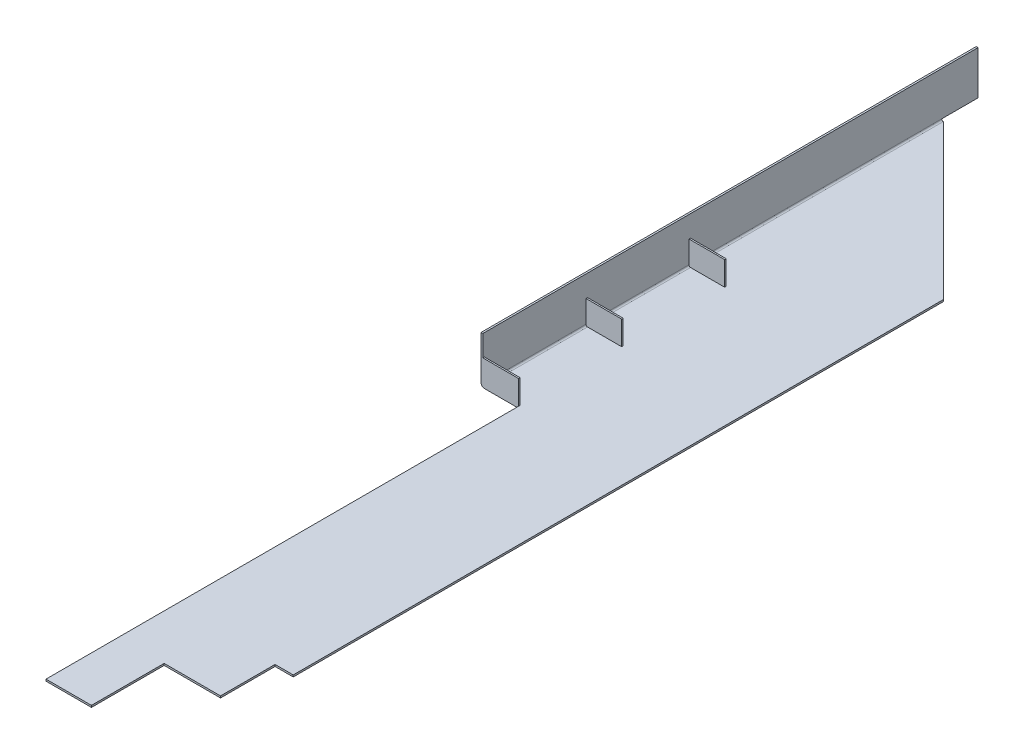
ISO-10303-21;
HEADER;
FILE_DESCRIPTION(('STEP AP214'),'2;1');
FILE_NAME('part.step','',(''),(''),'','','');
FILE_SCHEMA(('AUTOMOTIVE_DESIGN { 1 0 10303 214 1 1 1 1 }'));
ENDSEC;
DATA;
#1=APPLICATION_CONTEXT('core data for automotive mechanical design processes');
#2=APPLICATION_PROTOCOL_DEFINITION('international standard','automotive_design',2000,#1);
#3=PRODUCT_CONTEXT('',#1,'mechanical');
#4=PRODUCT('Part','Part','',(#3));
#5=PRODUCT_RELATED_PRODUCT_CATEGORY('part','',(#4));
#6=PRODUCT_DEFINITION_FORMATION('','',#4);
#7=PRODUCT_DEFINITION_CONTEXT('part definition',#1,'design');
#8=PRODUCT_DEFINITION('design','',#6,#7);
#9=PRODUCT_DEFINITION_SHAPE('','',#8);
#10=(LENGTH_UNIT() NAMED_UNIT(*) SI_UNIT(.MILLI.,.METRE.));
#11=(NAMED_UNIT(*) PLANE_ANGLE_UNIT() SI_UNIT($,.RADIAN.));
#12=(NAMED_UNIT(*) SI_UNIT($,.STERADIAN.) SOLID_ANGLE_UNIT());
#13=UNCERTAINTY_MEASURE_WITH_UNIT(LENGTH_MEASURE(1.E-05),#10,'distance_accuracy_value','');
#14=(GEOMETRIC_REPRESENTATION_CONTEXT(3) GLOBAL_UNCERTAINTY_ASSIGNED_CONTEXT((#13)) GLOBAL_UNIT_ASSIGNED_CONTEXT((#10,
#11,#12)) REPRESENTATION_CONTEXT('',''));
#15=CARTESIAN_POINT('',(0.,0.,0.));
#16=DIRECTION('',(0.,0.,1.));
#17=DIRECTION('',(1.,0.,0.));
#18=AXIS2_PLACEMENT_3D('',#15,#16,#17);
#19=CARTESIAN_POINT('',(475.,-56.,1885.));
#20=DIRECTION('',(0.,0.,1.));
#21=DIRECTION('',(1.,0.,0.));
#22=AXIS2_PLACEMENT_3D('',#19,#20,#21);
#23=PLANE('',#22);
#24=DIRECTION('',(1.,0.,0.));
#25=VECTOR('',#24,1.);
#26=CARTESIAN_POINT('',(612.,-53.,1885.));
#27=LINE('',#26,#25);
#28=CARTESIAN_POINT('',(612.,-53.,1885.));
#29=VERTEX_POINT('',#28);
#30=CARTESIAN_POINT('',(705.,-53.,1885.));
#31=VERTEX_POINT('',#30);
#32=EDGE_CURVE('E304',#29,#31,#27,.T.);
#33=ORIENTED_EDGE('',*,*,#32,.F.);
#34=DIRECTION('',(0.,1.,0.));
#35=VECTOR('',#34,1.);
#36=CARTESIAN_POINT('',(612.,-56.,1885.));
#37=LINE('',#36,#35);
#38=CARTESIAN_POINT('',(612.,-56.,1885.));
#39=VERTEX_POINT('',#38);
#40=EDGE_CURVE('E36',#39,#29,#37,.T.);
#41=ORIENTED_EDGE('',*,*,#40,.F.);
#42=DIRECTION('',(-1.,0.,0.));
#43=VECTOR('',#42,1.);
#44=CARTESIAN_POINT('',(705.,-56.,1885.));
#45=LINE('',#44,#43);
#46=CARTESIAN_POINT('',(705.,-56.,1885.));
#47=VERTEX_POINT('',#46);
#48=EDGE_CURVE('E320',#47,#39,#45,.T.);
#49=ORIENTED_EDGE('',*,*,#48,.F.);
#50=DIRECTION('',(0.,1.,0.));
#51=VECTOR('',#50,1.);
#52=CARTESIAN_POINT('',(705.,-56.,1885.));
#53=LINE('',#52,#51);
#54=EDGE_CURVE('E11',#47,#31,#53,.T.);
#55=ORIENTED_EDGE('',*,*,#54,.T.);
#56=EDGE_LOOP('',(#33,#41,#49,#55));
#57=FACE_BOUND('',#56,.T.);
#58=ADVANCED_FACE('F17',(#57),#23,.T.);
#59=CARTESIAN_POINT('',(705.,-56.,1885.));
#60=DIRECTION('',(-1.,0.,0.));
#61=DIRECTION('',(0.,-1.,0.));
#62=AXIS2_PLACEMENT_3D('',#59,#60,#61);
#63=PLANE('',#62);
#64=DIRECTION('',(0.,0.,-1.));
#65=VECTOR('',#64,1.);
#66=CARTESIAN_POINT('',(705.,-56.,1885.));
#67=LINE('',#66,#65);
#68=CARTESIAN_POINT('',(705.,-56.,1795.));
#69=VERTEX_POINT('',#68);
#70=EDGE_CURVE('E27',#47,#69,#67,.T.);
#71=ORIENTED_EDGE('',*,*,#70,.T.);
#72=DIRECTION('',(0.,1.,0.));
#73=VECTOR('',#72,1.);
#74=CARTESIAN_POINT('',(705.,-56.,1795.));
#75=LINE('',#74,#73);
#76=CARTESIAN_POINT('',(705.,-53.,1795.));
#77=VERTEX_POINT('',#76);
#78=EDGE_CURVE('E215',#69,#77,#75,.T.);
#79=ORIENTED_EDGE('',*,*,#78,.T.);
#80=DIRECTION('',(0.,0.,-1.));
#81=VECTOR('',#80,1.);
#82=CARTESIAN_POINT('',(705.,-53.,1885.));
#83=LINE('',#82,#81);
#84=EDGE_CURVE('E299',#31,#77,#83,.T.);
#85=ORIENTED_EDGE('',*,*,#84,.F.);
#86=ORIENTED_EDGE('',*,*,#54,.F.);
#87=EDGE_LOOP('',(#71,#79,#85,#86));
#88=FACE_BOUND('',#87,.T.);
#89=ADVANCED_FACE('F490',(#88),#63,.F.);
#90=CARTESIAN_POINT('',(735.,-53.,1885.));
#91=DIRECTION('',(0.,1.,0.));
#92=DIRECTION('',(0.,0.,-1.));
#93=AXIS2_PLACEMENT_3D('',#90,#91,#92);
#94=PLANE('',#93);
#95=DIRECTION('',(-1.,0.,0.));
#96=VECTOR('',#95,1.);
#97=CARTESIAN_POINT('',(735.,-53.,1795.));
#98=LINE('',#97,#96);
#99=CARTESIAN_POINT('',(735.,-53.,1795.));
#100=VERTEX_POINT('',#99);
#101=EDGE_CURVE('E201',#100,#77,#98,.T.);
#102=ORIENTED_EDGE('',*,*,#101,.F.);
#103=DIRECTION('',(0.,0.,1.));
#104=VECTOR('',#103,1.);
#105=CARTESIAN_POINT('',(735.,-53.,722.));
#106=LINE('',#105,#104);
#107=CARTESIAN_POINT('',(735.,-53.,722.));
#108=VERTEX_POINT('',#107);
#109=EDGE_CURVE('E194',#108,#100,#106,.T.);
#110=ORIENTED_EDGE('',*,*,#109,.F.);
#111=DIRECTION('',(-0.707106781186548,0.,-0.707106781186548));
#112=VECTOR('',#111,1.);
#113=CARTESIAN_POINT('',(735.,-53.,722.));
#114=LINE('',#113,#112);
#115=CARTESIAN_POINT('',(481.,-53.,468.));
#116=VERTEX_POINT('',#115);
#117=EDGE_CURVE('E197',#108,#116,#114,.T.);
#118=ORIENTED_EDGE('',*,*,#117,.T.);
#119=DIRECTION('',(1.,0.,0.));
#120=VECTOR('',#119,1.);
#121=CARTESIAN_POINT('',(480.6,-53.,468.));
#122=LINE('',#121,#120);
#123=CARTESIAN_POINT('',(480.6,-53.,468.));
#124=VERTEX_POINT('',#123);
#125=EDGE_CURVE('E289',#124,#116,#122,.T.);
#126=ORIENTED_EDGE('',*,*,#125,.F.);
#127=DIRECTION('',(0.,0.,1.));
#128=VECTOR('',#127,1.);
#129=CARTESIAN_POINT('',(480.6,-53.,468.));
#130=LINE('',#129,#128);
#131=CARTESIAN_POINT('',(480.6,-53.,882.5));
#132=VERTEX_POINT('',#131);
#133=EDGE_CURVE('E216',#124,#132,#130,.T.);
#134=ORIENTED_EDGE('',*,*,#133,.T.);
#135=DIRECTION('',(1.,0.,0.));
#136=VECTOR('',#135,1.);
#137=CARTESIAN_POINT('',(480.6,-53.,882.5));
#138=LINE('',#137,#136);
#139=CARTESIAN_POINT('',(537.,-53.,882.5));
#140=VERTEX_POINT('',#139);
#141=EDGE_CURVE('E372',#132,#140,#138,.T.);
#142=ORIENTED_EDGE('',*,*,#141,.T.);
#143=DIRECTION('',(0.,0.,-1.));
#144=VECTOR('',#143,1.);
#145=CARTESIAN_POINT('',(537.,-53.,885.));
#146=LINE('',#145,#144);
#147=CARTESIAN_POINT('',(537.,-53.,885.));
#148=VERTEX_POINT('',#147);
#149=EDGE_CURVE('E408',#148,#140,#146,.T.);
#150=ORIENTED_EDGE('',*,*,#149,.F.);
#151=DIRECTION('',(1.,0.,0.));
#152=VECTOR('',#151,1.);
#153=CARTESIAN_POINT('',(480.6,-53.,885.));
#154=LINE('',#153,#152);
#155=CARTESIAN_POINT('',(480.6,-53.,885.));
#156=VERTEX_POINT('',#155);
#157=EDGE_CURVE('E244',#156,#148,#154,.T.);
#158=ORIENTED_EDGE('',*,*,#157,.F.);
#159=DIRECTION('',(0.,0.,1.));
#160=VECTOR('',#159,1.);
#161=CARTESIAN_POINT('',(480.6,-53.,885.));
#162=LINE('',#161,#160);
#163=CARTESIAN_POINT('',(480.6,-53.,1052.5));
#164=VERTEX_POINT('',#163);
#165=EDGE_CURVE('E295',#156,#164,#162,.T.);
#166=ORIENTED_EDGE('',*,*,#165,.T.);
#167=DIRECTION('',(1.,0.,0.));
#168=VECTOR('',#167,1.);
#169=CARTESIAN_POINT('',(480.6,-53.,1052.5));
#170=LINE('',#169,#168);
#171=CARTESIAN_POINT('',(537.,-53.,1052.5));
#172=VERTEX_POINT('',#171);
#173=EDGE_CURVE('E292',#164,#172,#170,.T.);
#174=ORIENTED_EDGE('',*,*,#173,.T.);
#175=DIRECTION('',(0.,0.,-1.));
#176=VECTOR('',#175,1.);
#177=CARTESIAN_POINT('',(537.,-53.,1055.));
#178=LINE('',#177,#176);
#179=CARTESIAN_POINT('',(537.,-53.,1055.));
#180=VERTEX_POINT('',#179);
#181=EDGE_CURVE('E308',#180,#172,#178,.T.);
#182=ORIENTED_EDGE('',*,*,#181,.F.);
#183=DIRECTION('',(1.,0.,0.));
#184=VECTOR('',#183,1.);
#185=CARTESIAN_POINT('',(480.6,-53.,1055.));
#186=LINE('',#185,#184);
#187=CARTESIAN_POINT('',(480.6,-53.,1055.));
#188=VERTEX_POINT('',#187);
#189=EDGE_CURVE('E354',#188,#180,#186,.T.);
#190=ORIENTED_EDGE('',*,*,#189,.F.);
#191=DIRECTION('',(0.,0.,1.));
#192=VECTOR('',#191,1.);
#193=CARTESIAN_POINT('',(480.6,-53.,1055.));
#194=LINE('',#193,#192);
#195=CARTESIAN_POINT('',(480.6,-53.,1222.5));
#196=VERTEX_POINT('',#195);
#197=EDGE_CURVE('E296',#188,#196,#194,.T.);
#198=ORIENTED_EDGE('',*,*,#197,.T.);
#199=DIRECTION('',(1.,0.,0.));
#200=VECTOR('',#199,1.);
#201=CARTESIAN_POINT('',(480.6,-53.,1222.5));
#202=LINE('',#201,#200);
#203=CARTESIAN_POINT('',(537.,-53.,1222.5));
#204=VERTEX_POINT('',#203);
#205=EDGE_CURVE('E355',#196,#204,#202,.T.);
#206=ORIENTED_EDGE('',*,*,#205,.T.);
#207=DIRECTION('',(0.,0.,-1.));
#208=VECTOR('',#207,1.);
#209=CARTESIAN_POINT('',(537.,-53.,1225.));
#210=LINE('',#209,#208);
#211=CARTESIAN_POINT('',(537.,-53.,1225.));
#212=VERTEX_POINT('',#211);
#213=EDGE_CURVE('E287',#212,#204,#210,.T.);
#214=ORIENTED_EDGE('',*,*,#213,.F.);
#215=DIRECTION('',(0.,0.,-1.));
#216=VECTOR('',#215,1.);
#217=CARTESIAN_POINT('',(537.,-53.,2005.));
#218=LINE('',#217,#216);
#219=CARTESIAN_POINT('',(537.,-53.,2005.));
#220=VERTEX_POINT('',#219);
#221=EDGE_CURVE('E276',#220,#212,#218,.T.);
#222=ORIENTED_EDGE('',*,*,#221,.F.);
#223=DIRECTION('',(-1.,0.,0.));
#224=VECTOR('',#223,1.);
#225=CARTESIAN_POINT('',(612.,-53.,2005.));
#226=LINE('',#225,#224);
#227=CARTESIAN_POINT('',(612.,-53.,2005.));
#228=VERTEX_POINT('',#227);
#229=EDGE_CURVE('E360',#228,#220,#226,.T.);
#230=ORIENTED_EDGE('',*,*,#229,.F.);
#231=DIRECTION('',(0.,0.,1.));
#232=VECTOR('',#231,1.);
#233=CARTESIAN_POINT('',(612.,-53.,1885.));
#234=LINE('',#233,#232);
#235=EDGE_CURVE('E297',#29,#228,#234,.T.);
#236=ORIENTED_EDGE('',*,*,#235,.F.);
#237=ORIENTED_EDGE('',*,*,#32,.T.);
#238=ORIENTED_EDGE('',*,*,#84,.T.);
#239=EDGE_LOOP('',(#102,#110,#118,#126,#134,#142,#150,#158,#166,#174,#182,#190,#198,#206,#214,
#222,#230,#236,#237,#238));
#240=FACE_BOUND('',#239,.T.);
#241=ADVANCED_FACE('F196',(#240),#94,.T.);
#242=CARTESIAN_POINT('',(612.,-56.,1885.));
#243=DIRECTION('',(1.,0.,0.));
#244=DIRECTION('',(0.,0.,1.));
#245=AXIS2_PLACEMENT_3D('',#242,#243,#244);
#246=PLANE('',#245);
#247=ORIENTED_EDGE('',*,*,#235,.T.);
#248=DIRECTION('',(0.,1.,0.));
#249=VECTOR('',#248,1.);
#250=CARTESIAN_POINT('',(612.,-56.,2005.));
#251=LINE('',#250,#249);
#252=CARTESIAN_POINT('',(612.,-56.,2005.));
#253=VERTEX_POINT('',#252);
#254=EDGE_CURVE('E279',#253,#228,#251,.T.);
#255=ORIENTED_EDGE('',*,*,#254,.F.);
#256=DIRECTION('',(0.,0.,1.));
#257=VECTOR('',#256,1.);
#258=CARTESIAN_POINT('',(612.,-56.,1885.));
#259=LINE('',#258,#257);
#260=EDGE_CURVE('E242',#39,#253,#259,.T.);
#261=ORIENTED_EDGE('',*,*,#260,.F.);
#262=ORIENTED_EDGE('',*,*,#40,.T.);
#263=EDGE_LOOP('',(#247,#255,#261,#262));
#264=FACE_BOUND('',#263,.T.);
#265=ADVANCED_FACE('F547',(#264),#246,.T.);
#266=CARTESIAN_POINT('',(480.6,-56.,1885.));
#267=DIRECTION('',(0.,-1.,0.));
#268=DIRECTION('',(1.,0.,0.));
#269=AXIS2_PLACEMENT_3D('',#266,#267,#268);
#270=PLANE('',#269);
#271=ORIENTED_EDGE('',*,*,#48,.T.);
#272=ORIENTED_EDGE('',*,*,#260,.T.);
#273=DIRECTION('',(-1.,0.,0.));
#274=VECTOR('',#273,1.);
#275=CARTESIAN_POINT('',(612.,-56.,2005.));
#276=LINE('',#275,#274);
#277=CARTESIAN_POINT('',(537.,-56.,2005.));
#278=VERTEX_POINT('',#277);
#279=EDGE_CURVE('E239',#253,#278,#276,.T.);
#280=ORIENTED_EDGE('',*,*,#279,.T.);
#281=DIRECTION('',(0.,0.,-1.));
#282=VECTOR('',#281,1.);
#283=CARTESIAN_POINT('',(537.,-56.,2005.));
#284=LINE('',#283,#282);
#285=CARTESIAN_POINT('',(537.,-56.,1225.));
#286=VERTEX_POINT('',#285);
#287=EDGE_CURVE('E243',#278,#286,#284,.T.);
#288=ORIENTED_EDGE('',*,*,#287,.T.);
#289=DIRECTION('',(1.,0.,0.));
#290=VECTOR('',#289,1.);
#291=CARTESIAN_POINT('',(480.6,-56.,1225.));
#292=LINE('',#291,#290);
#293=CARTESIAN_POINT('',(480.6,-56.,1225.));
#294=VERTEX_POINT('',#293);
#295=EDGE_CURVE('E266',#294,#286,#292,.T.);
#296=ORIENTED_EDGE('',*,*,#295,.F.);
#297=DIRECTION('',(0.,0.,1.));
#298=VECTOR('',#297,1.);
#299=CARTESIAN_POINT('',(480.6,-56.,468.));
#300=LINE('',#299,#298);
#301=CARTESIAN_POINT('',(480.6,-56.,468.));
#302=VERTEX_POINT('',#301);
#303=EDGE_CURVE('E334',#302,#294,#300,.T.);
#304=ORIENTED_EDGE('',*,*,#303,.F.);
#305=DIRECTION('',(-1.,0.,0.));
#306=VECTOR('',#305,1.);
#307=CARTESIAN_POINT('',(481.,-56.,468.));
#308=LINE('',#307,#306);
#309=CARTESIAN_POINT('',(481.,-56.,468.));
#310=VERTEX_POINT('',#309);
#311=EDGE_CURVE('E283',#310,#302,#308,.T.);
#312=ORIENTED_EDGE('',*,*,#311,.F.);
#313=DIRECTION('',(-0.707106781186548,0.,-0.707106781186548));
#314=VECTOR('',#313,1.);
#315=CARTESIAN_POINT('',(735.,-56.,722.));
#316=LINE('',#315,#314);
#317=CARTESIAN_POINT('',(735.,-56.,722.));
#318=VERTEX_POINT('',#317);
#319=EDGE_CURVE('E222',#318,#310,#316,.T.);
#320=ORIENTED_EDGE('',*,*,#319,.F.);
#321=DIRECTION('',(0.,0.,1.));
#322=VECTOR('',#321,1.);
#323=CARTESIAN_POINT('',(735.,-56.,722.));
#324=LINE('',#323,#322);
#325=CARTESIAN_POINT('',(735.,-56.,1795.));
#326=VERTEX_POINT('',#325);
#327=EDGE_CURVE('E221',#318,#326,#324,.T.);
#328=ORIENTED_EDGE('',*,*,#327,.T.);
#329=DIRECTION('',(-1.,0.,0.));
#330=VECTOR('',#329,1.);
#331=CARTESIAN_POINT('',(735.,-56.,1795.));
#332=LINE('',#331,#330);
#333=EDGE_CURVE('E325',#326,#69,#332,.T.);
#334=ORIENTED_EDGE('',*,*,#333,.T.);
#335=ORIENTED_EDGE('',*,*,#70,.F.);
#336=EDGE_LOOP('',(#271,#272,#280,#288,#296,#304,#312,#320,#328,#334,#335));
#337=FACE_BOUND('',#336,.T.);
#338=ADVANCED_FACE('F550',(#337),#270,.T.);
#339=CARTESIAN_POINT('',(705.,-56.,1795.));
#340=DIRECTION('',(0.,0.,-1.));
#341=DIRECTION('',(0.,1.,0.));
#342=AXIS2_PLACEMENT_3D('',#339,#340,#341);
#343=PLANE('',#342);
#344=ORIENTED_EDGE('',*,*,#101,.T.);
#345=ORIENTED_EDGE('',*,*,#78,.F.);
#346=ORIENTED_EDGE('',*,*,#333,.F.);
#347=DIRECTION('',(0.,1.,0.));
#348=VECTOR('',#347,1.);
#349=CARTESIAN_POINT('',(735.,-56.,1795.));
#350=LINE('',#349,#348);
#351=EDGE_CURVE('E206',#326,#100,#350,.T.);
#352=ORIENTED_EDGE('',*,*,#351,.T.);
#353=EDGE_LOOP('',(#344,#345,#346,#352));
#354=FACE_BOUND('',#353,.T.);
#355=ADVANCED_FACE('F533',(#354),#343,.F.);
#356=CARTESIAN_POINT('',(735.,-56.,1885.));
#357=DIRECTION('',(1.,0.,0.));
#358=DIRECTION('',(0.,0.,1.));
#359=AXIS2_PLACEMENT_3D('',#356,#357,#358);
#360=PLANE('',#359);
#361=ORIENTED_EDGE('',*,*,#327,.F.);
#362=DIRECTION('',(0.,-1.,0.));
#363=VECTOR('',#362,1.);
#364=CARTESIAN_POINT('',(735.,-53.,722.));
#365=LINE('',#364,#363);
#366=EDGE_CURVE('E207',#108,#318,#365,.T.);
#367=ORIENTED_EDGE('',*,*,#366,.F.);
#368=ORIENTED_EDGE('',*,*,#109,.T.);
#369=ORIENTED_EDGE('',*,*,#351,.F.);
#370=EDGE_LOOP('',(#361,#367,#368,#369));
#371=FACE_BOUND('',#370,.T.);
#372=ADVANCED_FACE('F219',(#371),#360,.T.);
#373=CARTESIAN_POINT('',(735.,-56.,722.));
#374=DIRECTION('',(-0.707106781186548,0.,0.707106781186548));
#375=DIRECTION('',(0.,-1.,0.));
#376=AXIS2_PLACEMENT_3D('',#373,#374,#375);
#377=PLANE('',#376);
#378=ORIENTED_EDGE('',*,*,#366,.T.);
#379=ORIENTED_EDGE('',*,*,#319,.T.);
#380=DIRECTION('',(0.,1.,0.));
#381=VECTOR('',#380,1.);
#382=CARTESIAN_POINT('',(481.,-56.,468.));
#383=LINE('',#382,#381);
#384=EDGE_CURVE('E214',#310,#116,#383,.T.);
#385=ORIENTED_EDGE('',*,*,#384,.T.);
#386=ORIENTED_EDGE('',*,*,#117,.F.);
#387=EDGE_LOOP('',(#378,#379,#385,#386));
#388=FACE_BOUND('',#387,.T.);
#389=ADVANCED_FACE('F211',(#388),#377,.F.);
#390=CARTESIAN_POINT('',(475.,-56.,468.));
#391=DIRECTION('',(0.,0.,1.));
#392=DIRECTION('',(1.,0.,0.));
#393=AXIS2_PLACEMENT_3D('',#390,#391,#392);
#394=PLANE('',#393);
#395=CARTESIAN_POINT('',(480.6,-50.4,468.));
#396=DIRECTION('',(0.,0.,1.));
#397=DIRECTION('',(-1.,0.,0.));
#398=AXIS2_PLACEMENT_3D('',#395,#396,#397);
#399=CIRCLE('',#398,2.6);
#400=CARTESIAN_POINT('',(478.,-50.4,468.));
#401=VERTEX_POINT('',#400);
#402=EDGE_CURVE('E291',#401,#124,#399,.T.);
#403=ORIENTED_EDGE('',*,*,#402,.T.);
#404=ORIENTED_EDGE('',*,*,#125,.T.);
#405=ORIENTED_EDGE('',*,*,#384,.F.);
#406=ORIENTED_EDGE('',*,*,#311,.T.);
#407=CARTESIAN_POINT('',(480.6,-50.4,468.));
#408=DIRECTION('',(0.,0.,-1.));
#409=DIRECTION('',(0.,-1.,0.));
#410=AXIS2_PLACEMENT_3D('',#407,#408,#409);
#411=CIRCLE('',#410,5.6);
#412=CARTESIAN_POINT('',(475.,-50.4,468.));
#413=VERTEX_POINT('',#412);
#414=EDGE_CURVE('E280',#302,#413,#411,.T.);
#415=ORIENTED_EDGE('',*,*,#414,.T.);
#416=DIRECTION('',(1.,0.,0.));
#417=VECTOR('',#416,1.);
#418=CARTESIAN_POINT('',(475.,-50.4,468.));
#419=LINE('',#418,#417);
#420=EDGE_CURVE('E284',#413,#401,#419,.T.);
#421=ORIENTED_EDGE('',*,*,#420,.T.);
#422=EDGE_LOOP('',(#403,#404,#405,#406,#415,#421));
#423=FACE_BOUND('',#422,.T.);
#424=ADVANCED_FACE('F505',(#423),#394,.F.);
#425=CARTESIAN_POINT('',(478.,-50.4,468.));
#426=DIRECTION('',(0.,-1.,0.));
#427=DIRECTION('',(1.,0.,0.));
#428=AXIS2_PLACEMENT_3D('',#425,#426,#427);
#429=PLANE('',#428);
#430=DIRECTION('',(0.,0.,-1.));
#431=VECTOR('',#430,1.);
#432=CARTESIAN_POINT('',(475.,-50.4,468.));
#433=LINE('',#432,#431);
#434=CARTESIAN_POINT('',(475.,-50.4,408.));
#435=VERTEX_POINT('',#434);
#436=EDGE_CURVE('E345',#413,#435,#433,.T.);
#437=ORIENTED_EDGE('',*,*,#436,.T.);
#438=DIRECTION('',(-1.,0.,0.));
#439=VECTOR('',#438,1.);
#440=CARTESIAN_POINT('',(478.,-50.4,408.));
#441=LINE('',#440,#439);
#442=CARTESIAN_POINT('',(478.,-50.4,408.));
#443=VERTEX_POINT('',#442);
#444=EDGE_CURVE('E330',#443,#435,#441,.T.);
#445=ORIENTED_EDGE('',*,*,#444,.F.);
#446=DIRECTION('',(0.,0.,-1.));
#447=VECTOR('',#446,1.);
#448=CARTESIAN_POINT('',(478.,-50.4,468.));
#449=LINE('',#448,#447);
#450=EDGE_CURVE('E249',#401,#443,#449,.T.);
#451=ORIENTED_EDGE('',*,*,#450,.F.);
#452=ORIENTED_EDGE('',*,*,#420,.F.);
#453=EDGE_LOOP('',(#437,#445,#451,#452));
#454=FACE_BOUND('',#453,.T.);
#455=ADVANCED_FACE('F486',(#454),#429,.T.);
#456=CARTESIAN_POINT('',(478.,-50.4,1885.));
#457=DIRECTION('',(1.,0.,0.));
#458=DIRECTION('',(0.,0.,1.));
#459=AXIS2_PLACEMENT_3D('',#456,#457,#458);
#460=PLANE('',#459);
#461=DIRECTION('',(0.,1.,0.));
#462=VECTOR('',#461,1.);
#463=CARTESIAN_POINT('',(478.,-13.5,1225.));
#464=LINE('',#463,#462);
#465=CARTESIAN_POINT('',(478.,-13.5,1225.));
#466=VERTEX_POINT('',#465);
#467=CARTESIAN_POINT('',(478.,21.5,1225.));
#468=VERTEX_POINT('',#467);
#469=EDGE_CURVE('E359',#466,#468,#464,.T.);
#470=ORIENTED_EDGE('',*,*,#469,.F.);
#471=DIRECTION('',(0.,0.,-1.));
#472=VECTOR('',#471,1.);
#473=CARTESIAN_POINT('',(478.,-13.5,1225.));
#474=LINE('',#473,#472);
#475=CARTESIAN_POINT('',(478.,-13.5,1222.5));
#476=VERTEX_POINT('',#475);
#477=EDGE_CURVE('E236',#466,#476,#474,.T.);
#478=ORIENTED_EDGE('',*,*,#477,.T.);
#479=DIRECTION('',(0.,1.,0.));
#480=VECTOR('',#479,1.);
#481=CARTESIAN_POINT('',(478.,-50.4,1222.5));
#482=LINE('',#481,#480);
#483=CARTESIAN_POINT('',(478.,-50.4,1222.5));
#484=VERTEX_POINT('',#483);
#485=EDGE_CURVE('E313',#484,#476,#482,.T.);
#486=ORIENTED_EDGE('',*,*,#485,.F.);
#487=DIRECTION('',(0.,0.,1.));
#488=VECTOR('',#487,1.);
#489=CARTESIAN_POINT('',(478.,-50.4,1055.));
#490=LINE('',#489,#488);
#491=CARTESIAN_POINT('',(478.,-50.4,1055.));
#492=VERTEX_POINT('',#491);
#493=EDGE_CURVE('E307',#492,#484,#490,.T.);
#494=ORIENTED_EDGE('',*,*,#493,.F.);
#495=DIRECTION('',(0.,1.,0.));
#496=VECTOR('',#495,1.);
#497=CARTESIAN_POINT('',(478.,-50.4,1055.));
#498=LINE('',#497,#496);
#499=CARTESIAN_POINT('',(478.,-13.5,1055.));
#500=VERTEX_POINT('',#499);
#501=EDGE_CURVE('E234',#492,#500,#498,.T.);
#502=ORIENTED_EDGE('',*,*,#501,.T.);
#503=DIRECTION('',(0.,0.,1.));
#504=VECTOR('',#503,1.);
#505=CARTESIAN_POINT('',(478.,-13.5,1052.5));
#506=LINE('',#505,#504);
#507=CARTESIAN_POINT('',(478.,-13.5,1052.5));
#508=VERTEX_POINT('',#507);
#509=EDGE_CURVE('E352',#508,#500,#506,.T.);
#510=ORIENTED_EDGE('',*,*,#509,.F.);
#511=DIRECTION('',(0.,1.,0.));
#512=VECTOR('',#511,1.);
#513=CARTESIAN_POINT('',(478.,-50.4,1052.5));
#514=LINE('',#513,#512);
#515=CARTESIAN_POINT('',(478.,-50.4,1052.5));
#516=VERTEX_POINT('',#515);
#517=EDGE_CURVE('E419',#516,#508,#514,.T.);
#518=ORIENTED_EDGE('',*,*,#517,.F.);
#519=DIRECTION('',(0.,0.,1.));
#520=VECTOR('',#519,1.);
#521=CARTESIAN_POINT('',(478.,-50.4,885.));
#522=LINE('',#521,#520);
#523=CARTESIAN_POINT('',(478.,-50.4,885.));
#524=VERTEX_POINT('',#523);
#525=EDGE_CURVE('E267',#524,#516,#522,.T.);
#526=ORIENTED_EDGE('',*,*,#525,.F.);
#527=DIRECTION('',(0.,1.,0.));
#528=VECTOR('',#527,1.);
#529=CARTESIAN_POINT('',(478.,-50.4,885.));
#530=LINE('',#529,#528);
#531=CARTESIAN_POINT('',(478.,-13.5,885.));
#532=VERTEX_POINT('',#531);
#533=EDGE_CURVE('E237',#524,#532,#530,.T.);
#534=ORIENTED_EDGE('',*,*,#533,.T.);
#535=DIRECTION('',(0.,0.,1.));
#536=VECTOR('',#535,1.);
#537=CARTESIAN_POINT('',(478.,-13.5,882.5));
#538=LINE('',#537,#536);
#539=CARTESIAN_POINT('',(478.,-13.5,882.5));
#540=VERTEX_POINT('',#539);
#541=EDGE_CURVE('E248',#540,#532,#538,.T.);
#542=ORIENTED_EDGE('',*,*,#541,.F.);
#543=DIRECTION('',(0.,1.,0.));
#544=VECTOR('',#543,1.);
#545=CARTESIAN_POINT('',(478.,-50.4,882.5));
#546=LINE('',#545,#544);
#547=CARTESIAN_POINT('',(478.,-50.4,882.5));
#548=VERTEX_POINT('',#547);
#549=EDGE_CURVE('E275',#548,#540,#546,.T.);
#550=ORIENTED_EDGE('',*,*,#549,.F.);
#551=DIRECTION('',(0.,0.,1.));
#552=VECTOR('',#551,1.);
#553=CARTESIAN_POINT('',(478.,-50.4,468.));
#554=LINE('',#553,#552);
#555=EDGE_CURVE('E318',#401,#548,#554,.T.);
#556=ORIENTED_EDGE('',*,*,#555,.F.);
#557=ORIENTED_EDGE('',*,*,#450,.T.);
#558=DIRECTION('',(0.,-1.,0.));
#559=VECTOR('',#558,1.);
#560=CARTESIAN_POINT('',(478.,21.5,408.));
#561=LINE('',#560,#559);
#562=CARTESIAN_POINT('',(478.,21.5,408.));
#563=VERTEX_POINT('',#562);
#564=EDGE_CURVE('E331',#563,#443,#561,.T.);
#565=ORIENTED_EDGE('',*,*,#564,.F.);
#566=DIRECTION('',(0.,0.,-1.));
#567=VECTOR('',#566,1.);
#568=CARTESIAN_POINT('',(478.,21.5,1225.));
#569=LINE('',#568,#567);
#570=EDGE_CURVE('E227',#468,#563,#569,.T.);
#571=ORIENTED_EDGE('',*,*,#570,.F.);
#572=EDGE_LOOP('',(#470,#478,#486,#494,#502,#510,#518,#526,#534,#542,#550,#556,#557,#565,#571));
#573=FACE_BOUND('',#572,.T.);
#574=ADVANCED_FACE('F474',(#573),#460,.T.);
#575=CARTESIAN_POINT('',(478.,21.5,1885.));
#576=DIRECTION('',(0.,1.,0.));
#577=DIRECTION('',(0.,0.,-1.));
#578=AXIS2_PLACEMENT_3D('',#575,#576,#577);
#579=PLANE('',#578);
#580=DIRECTION('',(-1.,0.,0.));
#581=VECTOR('',#580,1.);
#582=CARTESIAN_POINT('',(478.,21.5,1225.));
#583=LINE('',#582,#581);
#584=CARTESIAN_POINT('',(475.,21.5,1225.));
#585=VERTEX_POINT('',#584);
#586=EDGE_CURVE('E337',#468,#585,#583,.T.);
#587=ORIENTED_EDGE('',*,*,#586,.F.);
#588=ORIENTED_EDGE('',*,*,#570,.T.);
#589=DIRECTION('',(1.,0.,0.));
#590=VECTOR('',#589,1.);
#591=CARTESIAN_POINT('',(475.,21.5,408.));
#592=LINE('',#591,#590);
#593=CARTESIAN_POINT('',(475.,21.5,408.));
#594=VERTEX_POINT('',#593);
#595=EDGE_CURVE('E351',#594,#563,#592,.T.);
#596=ORIENTED_EDGE('',*,*,#595,.F.);
#597=DIRECTION('',(0.,0.,1.));
#598=VECTOR('',#597,1.);
#599=CARTESIAN_POINT('',(475.,21.5,408.));
#600=LINE('',#599,#598);
#601=EDGE_CURVE('E380',#594,#585,#600,.T.);
#602=ORIENTED_EDGE('',*,*,#601,.T.);
#603=EDGE_LOOP('',(#587,#588,#596,#602));
#604=FACE_BOUND('',#603,.T.);
#605=ADVANCED_FACE('F478',(#604),#579,.T.);
#606=CARTESIAN_POINT('',(475.,21.5,1885.));
#607=DIRECTION('',(-1.,0.,0.));
#608=DIRECTION('',(0.,-1.,0.));
#609=AXIS2_PLACEMENT_3D('',#606,#607,#608);
#610=PLANE('',#609);
#611=DIRECTION('',(0.,-1.,0.));
#612=VECTOR('',#611,1.);
#613=CARTESIAN_POINT('',(475.,21.5,1225.));
#614=LINE('',#613,#612);
#615=CARTESIAN_POINT('',(475.,-50.4,1225.));
#616=VERTEX_POINT('',#615);
#617=EDGE_CURVE('E265',#585,#616,#614,.T.);
#618=ORIENTED_EDGE('',*,*,#617,.F.);
#619=ORIENTED_EDGE('',*,*,#601,.F.);
#620=DIRECTION('',(0.,1.,0.));
#621=VECTOR('',#620,1.);
#622=CARTESIAN_POINT('',(475.,-50.4,408.));
#623=LINE('',#622,#621);
#624=EDGE_CURVE('E332',#435,#594,#623,.T.);
#625=ORIENTED_EDGE('',*,*,#624,.F.);
#626=ORIENTED_EDGE('',*,*,#436,.F.);
#627=DIRECTION('',(0.,0.,1.));
#628=VECTOR('',#627,1.);
#629=CARTESIAN_POINT('',(475.,-50.4,468.));
#630=LINE('',#629,#628);
#631=EDGE_CURVE('E21',#413,#616,#630,.T.);
#632=ORIENTED_EDGE('',*,*,#631,.T.);
#633=EDGE_LOOP('',(#618,#619,#625,#626,#632));
#634=FACE_BOUND('',#633,.T.);
#635=ADVANCED_FACE('F19',(#634),#610,.T.);
#636=CARTESIAN_POINT('',(480.6,-50.4,1885.));
#637=DIRECTION('',(0.,0.,1.));
#638=DIRECTION('',(1.,0.,0.));
#639=AXIS2_PLACEMENT_3D('',#636,#637,#638);
#640=CYLINDRICAL_SURFACE('',#639,5.6);
#641=ORIENTED_EDGE('',*,*,#303,.T.);
#642=CARTESIAN_POINT('',(480.6,-50.4,1225.));
#643=DIRECTION('',(0.,0.,1.));
#644=DIRECTION('',(-1.,-1.081674432563E-13,0.));
#645=AXIS2_PLACEMENT_3D('',#642,#643,#644);
#646=CIRCLE('',#645,5.6);
#647=EDGE_CURVE('E262',#616,#294,#646,.T.);
#648=ORIENTED_EDGE('',*,*,#647,.F.);
#649=ORIENTED_EDGE('',*,*,#631,.F.);
#650=ORIENTED_EDGE('',*,*,#414,.F.);
#651=EDGE_LOOP('',(#641,#648,#649,#650));
#652=FACE_BOUND('',#651,.T.);
#653=ADVANCED_FACE('F396',(#652),#640,.T.);
#654=CARTESIAN_POINT('',(475.,-56.,1225.));
#655=DIRECTION('',(0.,0.,-1.));
#656=DIRECTION('',(0.,1.,0.));
#657=AXIS2_PLACEMENT_3D('',#654,#655,#656);
#658=PLANE('',#657);
#659=ORIENTED_EDGE('',*,*,#586,.T.);
#660=ORIENTED_EDGE('',*,*,#617,.T.);
#661=ORIENTED_EDGE('',*,*,#647,.T.);
#662=ORIENTED_EDGE('',*,*,#295,.T.);
#663=DIRECTION('',(0.,1.,0.));
#664=VECTOR('',#663,1.);
#665=CARTESIAN_POINT('',(537.,-56.,1225.));
#666=LINE('',#665,#664);
#667=EDGE_CURVE('E329',#286,#212,#666,.T.);
#668=ORIENTED_EDGE('',*,*,#667,.T.);
#669=DIRECTION('',(0.,-1.,0.));
#670=VECTOR('',#669,1.);
#671=CARTESIAN_POINT('',(537.,-13.5,1225.));
#672=LINE('',#671,#670);
#673=CARTESIAN_POINT('',(537.,-13.5,1225.));
#674=VERTEX_POINT('',#673);
#675=EDGE_CURVE('E342',#674,#212,#672,.T.);
#676=ORIENTED_EDGE('',*,*,#675,.F.);
#677=DIRECTION('',(1.,0.,0.));
#678=VECTOR('',#677,1.);
#679=CARTESIAN_POINT('',(478.,-13.5,1225.));
#680=LINE('',#679,#678);
#681=EDGE_CURVE('E232',#466,#674,#680,.T.);
#682=ORIENTED_EDGE('',*,*,#681,.F.);
#683=ORIENTED_EDGE('',*,*,#469,.T.);
#684=EDGE_LOOP('',(#659,#660,#661,#662,#668,#676,#682,#683));
#685=FACE_BOUND('',#684,.T.);
#686=ADVANCED_FACE('F398',(#685),#658,.F.);
#687=CARTESIAN_POINT('',(475.,-13.5,623.));
#688=DIRECTION('',(0.,1.,0.));
#689=DIRECTION('',(0.,0.,-1.));
#690=AXIS2_PLACEMENT_3D('',#687,#688,#689);
#691=PLANE('',#690);
#692=ORIENTED_EDGE('',*,*,#681,.T.);
#693=DIRECTION('',(0.,0.,-1.));
#694=VECTOR('',#693,1.);
#695=CARTESIAN_POINT('',(537.,-13.5,1225.));
#696=LINE('',#695,#694);
#697=CARTESIAN_POINT('',(537.,-13.5,1222.5));
#698=VERTEX_POINT('',#697);
#699=EDGE_CURVE('E229',#674,#698,#696,.T.);
#700=ORIENTED_EDGE('',*,*,#699,.T.);
#701=DIRECTION('',(-1.,0.,0.));
#702=VECTOR('',#701,1.);
#703=CARTESIAN_POINT('',(537.,-13.5,1222.5));
#704=LINE('',#703,#702);
#705=EDGE_CURVE('E233',#698,#476,#704,.T.);
#706=ORIENTED_EDGE('',*,*,#705,.T.);
#707=ORIENTED_EDGE('',*,*,#477,.F.);
#708=EDGE_LOOP('',(#692,#700,#706,#707));
#709=FACE_BOUND('',#708,.T.);
#710=ADVANCED_FACE('F471',(#709),#691,.T.);
#711=CARTESIAN_POINT('',(537.,-13.5,1222.5));
#712=DIRECTION('',(0.,0.,-1.));
#713=DIRECTION('',(0.,1.,0.));
#714=AXIS2_PLACEMENT_3D('',#711,#712,#713);
#715=PLANE('',#714);
#716=ORIENTED_EDGE('',*,*,#705,.F.);
#717=DIRECTION('',(0.,-1.,0.));
#718=VECTOR('',#717,1.);
#719=CARTESIAN_POINT('',(537.,-13.5,1222.5));
#720=LINE('',#719,#718);
#721=EDGE_CURVE('E302',#698,#204,#720,.T.);
#722=ORIENTED_EDGE('',*,*,#721,.T.);
#723=ORIENTED_EDGE('',*,*,#205,.F.);
#724=CARTESIAN_POINT('',(480.6,-50.4,1222.5));
#725=DIRECTION('',(0.,0.,1.));
#726=DIRECTION('',(-1.,0.,0.));
#727=AXIS2_PLACEMENT_3D('',#724,#725,#726);
#728=CIRCLE('',#727,2.6);
#729=EDGE_CURVE('E270',#484,#196,#728,.T.);
#730=ORIENTED_EDGE('',*,*,#729,.F.);
#731=ORIENTED_EDGE('',*,*,#485,.T.);
#732=EDGE_LOOP('',(#716,#722,#723,#730,#731));
#733=FACE_BOUND('',#732,.T.);
#734=ADVANCED_FACE('F545',(#733),#715,.T.);
#735=CARTESIAN_POINT('',(480.6,-50.4,1885.));
#736=DIRECTION('',(0.,0.,1.));
#737=DIRECTION('',(1.,0.,0.));
#738=AXIS2_PLACEMENT_3D('',#735,#736,#737);
#739=CYLINDRICAL_SURFACE('',#738,2.6);
#740=ORIENTED_EDGE('',*,*,#493,.T.);
#741=ORIENTED_EDGE('',*,*,#729,.T.);
#742=ORIENTED_EDGE('',*,*,#197,.F.);
#743=CARTESIAN_POINT('',(480.6,-50.4,1055.));
#744=DIRECTION('',(0.,0.,1.));
#745=DIRECTION('',(-1.,0.,0.));
#746=AXIS2_PLACEMENT_3D('',#743,#744,#745);
#747=CIRCLE('',#746,2.6);
#748=EDGE_CURVE('E324',#492,#188,#747,.T.);
#749=ORIENTED_EDGE('',*,*,#748,.F.);
#750=EDGE_LOOP('',(#740,#741,#742,#749));
#751=FACE_BOUND('',#750,.T.);
#752=ADVANCED_FACE('F538',(#751),#739,.F.);
#753=CARTESIAN_POINT('',(480.6,-50.4,1885.));
#754=DIRECTION('',(0.,0.,1.));
#755=DIRECTION('',(1.,0.,0.));
#756=AXIS2_PLACEMENT_3D('',#753,#754,#755);
#757=CYLINDRICAL_SURFACE('',#756,2.6);
#758=ORIENTED_EDGE('',*,*,#525,.T.);
#759=CARTESIAN_POINT('',(480.6,-50.4,1052.5));
#760=DIRECTION('',(0.,0.,1.));
#761=DIRECTION('',(-1.,0.,0.));
#762=AXIS2_PLACEMENT_3D('',#759,#760,#761);
#763=CIRCLE('',#762,2.6);
#764=EDGE_CURVE('E271',#516,#164,#763,.T.);
#765=ORIENTED_EDGE('',*,*,#764,.T.);
#766=ORIENTED_EDGE('',*,*,#165,.F.);
#767=CARTESIAN_POINT('',(480.6,-50.4,885.));
#768=DIRECTION('',(0.,0.,1.));
#769=DIRECTION('',(-1.,0.,0.));
#770=AXIS2_PLACEMENT_3D('',#767,#768,#769);
#771=CIRCLE('',#770,2.6);
#772=EDGE_CURVE('E247',#524,#156,#771,.T.);
#773=ORIENTED_EDGE('',*,*,#772,.F.);
#774=EDGE_LOOP('',(#758,#765,#766,#773));
#775=FACE_BOUND('',#774,.T.);
#776=ADVANCED_FACE('F534',(#775),#757,.F.);
#777=CARTESIAN_POINT('',(480.6,-50.4,1885.));
#778=DIRECTION('',(0.,0.,1.));
#779=DIRECTION('',(1.,0.,0.));
#780=AXIS2_PLACEMENT_3D('',#777,#778,#779);
#781=CYLINDRICAL_SURFACE('',#780,2.6);
#782=ORIENTED_EDGE('',*,*,#555,.T.);
#783=CARTESIAN_POINT('',(480.6,-50.4,882.5));
#784=DIRECTION('',(0.,0.,1.));
#785=DIRECTION('',(-1.,0.,0.));
#786=AXIS2_PLACEMENT_3D('',#783,#784,#785);
#787=CIRCLE('',#786,2.6);
#788=EDGE_CURVE('E321',#548,#132,#787,.T.);
#789=ORIENTED_EDGE('',*,*,#788,.T.);
#790=ORIENTED_EDGE('',*,*,#133,.F.);
#791=ORIENTED_EDGE('',*,*,#402,.F.);
#792=EDGE_LOOP('',(#782,#789,#790,#791));
#793=FACE_BOUND('',#792,.T.);
#794=ADVANCED_FACE('F537',(#793),#781,.F.);
#795=CARTESIAN_POINT('',(478.,-13.5,1055.));
#796=DIRECTION('',(0.,0.,1.));
#797=DIRECTION('',(1.,0.,0.));
#798=AXIS2_PLACEMENT_3D('',#795,#796,#797);
#799=PLANE('',#798);
#800=ORIENTED_EDGE('',*,*,#748,.T.);
#801=ORIENTED_EDGE('',*,*,#189,.T.);
#802=DIRECTION('',(0.,-1.,0.));
#803=VECTOR('',#802,1.);
#804=CARTESIAN_POINT('',(537.,-13.5,1055.));
#805=LINE('',#804,#803);
#806=CARTESIAN_POINT('',(537.,-13.5,1055.));
#807=VERTEX_POINT('',#806);
#808=EDGE_CURVE('E310',#807,#180,#805,.T.);
#809=ORIENTED_EDGE('',*,*,#808,.F.);
#810=DIRECTION('',(1.,0.,0.));
#811=VECTOR('',#810,1.);
#812=CARTESIAN_POINT('',(478.,-13.5,1055.));
#813=LINE('',#812,#811);
#814=EDGE_CURVE('E255',#500,#807,#813,.T.);
#815=ORIENTED_EDGE('',*,*,#814,.F.);
#816=ORIENTED_EDGE('',*,*,#501,.F.);
#817=EDGE_LOOP('',(#800,#801,#809,#815,#816));
#818=FACE_BOUND('',#817,.T.);
#819=ADVANCED_FACE('F503',(#818),#799,.T.);
#820=CARTESIAN_POINT('',(475.,-13.5,623.));
#821=DIRECTION('',(0.,1.,0.));
#822=DIRECTION('',(0.,0.,-1.));
#823=AXIS2_PLACEMENT_3D('',#820,#821,#822);
#824=PLANE('',#823);
#825=ORIENTED_EDGE('',*,*,#509,.T.);
#826=ORIENTED_EDGE('',*,*,#814,.T.);
#827=DIRECTION('',(0.,0.,-1.));
#828=VECTOR('',#827,1.);
#829=CARTESIAN_POINT('',(537.,-13.5,1055.));
#830=LINE('',#829,#828);
#831=CARTESIAN_POINT('',(537.,-13.5,1052.5));
#832=VERTEX_POINT('',#831);
#833=EDGE_CURVE('E252',#807,#832,#830,.T.);
#834=ORIENTED_EDGE('',*,*,#833,.T.);
#835=DIRECTION('',(-1.,0.,0.));
#836=VECTOR('',#835,1.);
#837=CARTESIAN_POINT('',(537.,-13.5,1052.5));
#838=LINE('',#837,#836);
#839=EDGE_CURVE('E256',#832,#508,#838,.T.);
#840=ORIENTED_EDGE('',*,*,#839,.T.);
#841=EDGE_LOOP('',(#825,#826,#834,#840));
#842=FACE_BOUND('',#841,.T.);
#843=ADVANCED_FACE('F439',(#842),#824,.T.);
#844=CARTESIAN_POINT('',(537.,-13.5,1052.5));
#845=DIRECTION('',(0.,0.,-1.));
#846=DIRECTION('',(0.,1.,0.));
#847=AXIS2_PLACEMENT_3D('',#844,#845,#846);
#848=PLANE('',#847);
#849=ORIENTED_EDGE('',*,*,#839,.F.);
#850=DIRECTION('',(0.,-1.,0.));
#851=VECTOR('',#850,1.);
#852=CARTESIAN_POINT('',(537.,-13.5,1052.5));
#853=LINE('',#852,#851);
#854=EDGE_CURVE('E421',#832,#172,#853,.T.);
#855=ORIENTED_EDGE('',*,*,#854,.T.);
#856=ORIENTED_EDGE('',*,*,#173,.F.);
#857=ORIENTED_EDGE('',*,*,#764,.F.);
#858=ORIENTED_EDGE('',*,*,#517,.T.);
#859=EDGE_LOOP('',(#849,#855,#856,#857,#858));
#860=FACE_BOUND('',#859,.T.);
#861=ADVANCED_FACE('F448',(#860),#848,.T.);
#862=CARTESIAN_POINT('',(537.,-13.5,1055.));
#863=DIRECTION('',(1.,0.,0.));
#864=DIRECTION('',(0.,0.,1.));
#865=AXIS2_PLACEMENT_3D('',#862,#863,#864);
#866=PLANE('',#865);
#867=ORIENTED_EDGE('',*,*,#854,.F.);
#868=ORIENTED_EDGE('',*,*,#833,.F.);
#869=ORIENTED_EDGE('',*,*,#808,.T.);
#870=ORIENTED_EDGE('',*,*,#181,.T.);
#871=EDGE_LOOP('',(#867,#868,#869,#870));
#872=FACE_BOUND('',#871,.T.);
#873=ADVANCED_FACE('F446',(#872),#866,.T.);
#874=CARTESIAN_POINT('',(478.,-13.5,885.));
#875=DIRECTION('',(0.,0.,1.));
#876=DIRECTION('',(1.,0.,0.));
#877=AXIS2_PLACEMENT_3D('',#874,#875,#876);
#878=PLANE('',#877);
#879=ORIENTED_EDGE('',*,*,#772,.T.);
#880=ORIENTED_EDGE('',*,*,#157,.T.);
#881=DIRECTION('',(0.,-1.,0.));
#882=VECTOR('',#881,1.);
#883=CARTESIAN_POINT('',(537.,-13.5,885.));
#884=LINE('',#883,#882);
#885=CARTESIAN_POINT('',(537.,-13.5,885.));
#886=VERTEX_POINT('',#885);
#887=EDGE_CURVE('E405',#886,#148,#884,.T.);
#888=ORIENTED_EDGE('',*,*,#887,.F.);
#889=DIRECTION('',(1.,0.,0.));
#890=VECTOR('',#889,1.);
#891=CARTESIAN_POINT('',(478.,-13.5,885.));
#892=LINE('',#891,#890);
#893=EDGE_CURVE('E260',#532,#886,#892,.T.);
#894=ORIENTED_EDGE('',*,*,#893,.F.);
#895=ORIENTED_EDGE('',*,*,#533,.F.);
#896=EDGE_LOOP('',(#879,#880,#888,#894,#895));
#897=FACE_BOUND('',#896,.T.);
#898=ADVANCED_FACE('F500',(#897),#878,.T.);
#899=CARTESIAN_POINT('',(475.,-13.5,623.));
#900=DIRECTION('',(0.,1.,0.));
#901=DIRECTION('',(0.,0.,-1.));
#902=AXIS2_PLACEMENT_3D('',#899,#900,#901);
#903=PLANE('',#902);
#904=ORIENTED_EDGE('',*,*,#541,.T.);
#905=ORIENTED_EDGE('',*,*,#893,.T.);
#906=DIRECTION('',(0.,0.,-1.));
#907=VECTOR('',#906,1.);
#908=CARTESIAN_POINT('',(537.,-13.5,885.));
#909=LINE('',#908,#907);
#910=CARTESIAN_POINT('',(537.,-13.5,882.5));
#911=VERTEX_POINT('',#910);
#912=EDGE_CURVE('E257',#886,#911,#909,.T.);
#913=ORIENTED_EDGE('',*,*,#912,.T.);
#914=DIRECTION('',(-1.,0.,0.));
#915=VECTOR('',#914,1.);
#916=CARTESIAN_POINT('',(537.,-13.5,882.5));
#917=LINE('',#916,#915);
#918=EDGE_CURVE('E261',#911,#540,#917,.T.);
#919=ORIENTED_EDGE('',*,*,#918,.T.);
#920=EDGE_LOOP('',(#904,#905,#913,#919));
#921=FACE_BOUND('',#920,.T.);
#922=ADVANCED_FACE('F516',(#921),#903,.T.);
#923=CARTESIAN_POINT('',(537.,-13.5,882.5));
#924=DIRECTION('',(0.,0.,-1.));
#925=DIRECTION('',(0.,1.,0.));
#926=AXIS2_PLACEMENT_3D('',#923,#924,#925);
#927=PLANE('',#926);
#928=ORIENTED_EDGE('',*,*,#918,.F.);
#929=DIRECTION('',(0.,-1.,0.));
#930=VECTOR('',#929,1.);
#931=CARTESIAN_POINT('',(537.,-13.5,882.5));
#932=LINE('',#931,#930);
#933=EDGE_CURVE('E272',#911,#140,#932,.T.);
#934=ORIENTED_EDGE('',*,*,#933,.T.);
#935=ORIENTED_EDGE('',*,*,#141,.F.);
#936=ORIENTED_EDGE('',*,*,#788,.F.);
#937=ORIENTED_EDGE('',*,*,#549,.T.);
#938=EDGE_LOOP('',(#928,#934,#935,#936,#937));
#939=FACE_BOUND('',#938,.T.);
#940=ADVANCED_FACE('F512',(#939),#927,.T.);
#941=CARTESIAN_POINT('',(537.,-13.5,885.));
#942=DIRECTION('',(1.,0.,0.));
#943=DIRECTION('',(0.,0.,1.));
#944=AXIS2_PLACEMENT_3D('',#941,#942,#943);
#945=PLANE('',#944);
#946=ORIENTED_EDGE('',*,*,#933,.F.);
#947=ORIENTED_EDGE('',*,*,#912,.F.);
#948=ORIENTED_EDGE('',*,*,#887,.T.);
#949=ORIENTED_EDGE('',*,*,#149,.T.);
#950=EDGE_LOOP('',(#946,#947,#948,#949));
#951=FACE_BOUND('',#950,.T.);
#952=ADVANCED_FACE('F515',(#951),#945,.T.);
#953=CARTESIAN_POINT('',(537.,-13.5,1225.));
#954=DIRECTION('',(1.,0.,0.));
#955=DIRECTION('',(0.,0.,1.));
#956=AXIS2_PLACEMENT_3D('',#953,#954,#955);
#957=PLANE('',#956);
#958=ORIENTED_EDGE('',*,*,#721,.F.);
#959=ORIENTED_EDGE('',*,*,#699,.F.);
#960=ORIENTED_EDGE('',*,*,#675,.T.);
#961=ORIENTED_EDGE('',*,*,#213,.T.);
#962=EDGE_LOOP('',(#958,#959,#960,#961));
#963=FACE_BOUND('',#962,.T.);
#964=ADVANCED_FACE('F464',(#963),#957,.T.);
#965=CARTESIAN_POINT('',(537.,-56.,1225.));
#966=DIRECTION('',(1.,0.,0.));
#967=DIRECTION('',(0.,0.,1.));
#968=AXIS2_PLACEMENT_3D('',#965,#966,#967);
#969=PLANE('',#968);
#970=ORIENTED_EDGE('',*,*,#667,.F.);
#971=ORIENTED_EDGE('',*,*,#287,.F.);
#972=DIRECTION('',(0.,1.,0.));
#973=VECTOR('',#972,1.);
#974=CARTESIAN_POINT('',(537.,-56.,2005.));
#975=LINE('',#974,#973);
#976=EDGE_CURVE('E278',#278,#220,#975,.T.);
#977=ORIENTED_EDGE('',*,*,#976,.T.);
#978=ORIENTED_EDGE('',*,*,#221,.T.);
#979=EDGE_LOOP('',(#970,#971,#977,#978));
#980=FACE_BOUND('',#979,.T.);
#981=ADVANCED_FACE('F527',(#980),#969,.F.);
#982=CARTESIAN_POINT('',(612.,-56.,2005.));
#983=DIRECTION('',(0.,0.,1.));
#984=DIRECTION('',(1.,0.,0.));
#985=AXIS2_PLACEMENT_3D('',#982,#983,#984);
#986=PLANE('',#985);
#987=ORIENTED_EDGE('',*,*,#254,.T.);
#988=ORIENTED_EDGE('',*,*,#229,.T.);
#989=ORIENTED_EDGE('',*,*,#976,.F.);
#990=ORIENTED_EDGE('',*,*,#279,.F.);
#991=EDGE_LOOP('',(#987,#988,#989,#990));
#992=FACE_BOUND('',#991,.T.);
#993=ADVANCED_FACE('F525',(#992),#986,.T.);
#994=CARTESIAN_POINT('',(475.,-56.,408.));
#995=DIRECTION('',(0.,0.,-1.));
#996=DIRECTION('',(0.,1.,0.));
#997=AXIS2_PLACEMENT_3D('',#994,#995,#996);
#998=PLANE('',#997);
#999=ORIENTED_EDGE('',*,*,#564,.T.);
#1000=ORIENTED_EDGE('',*,*,#444,.T.);
#1001=ORIENTED_EDGE('',*,*,#624,.T.);
#1002=ORIENTED_EDGE('',*,*,#595,.T.);
#1003=EDGE_LOOP('',(#999,#1000,#1001,#1002));
#1004=FACE_BOUND('',#1003,.T.);
#1005=ADVANCED_FACE('F522',(#1004),#998,.T.);
#1006=CLOSED_SHELL('',(#58,#89,#241,#265,#338,#355,#372,#389,#424,#455,#574,#605,#635,#653,#686,
#710,#734,#752,#776,#794,#819,#843,#861,#873,#898,#922,#940,#952,#964,#981,#993,#1005));
#1007=MANIFOLD_SOLID_BREP('B1',#1006);
#1008=ADVANCED_BREP_SHAPE_REPRESENTATION('',(#18,#1007),#14);
#1009=SHAPE_DEFINITION_REPRESENTATION(#9,#1008);
ENDSEC;
END-ISO-10303-21;
